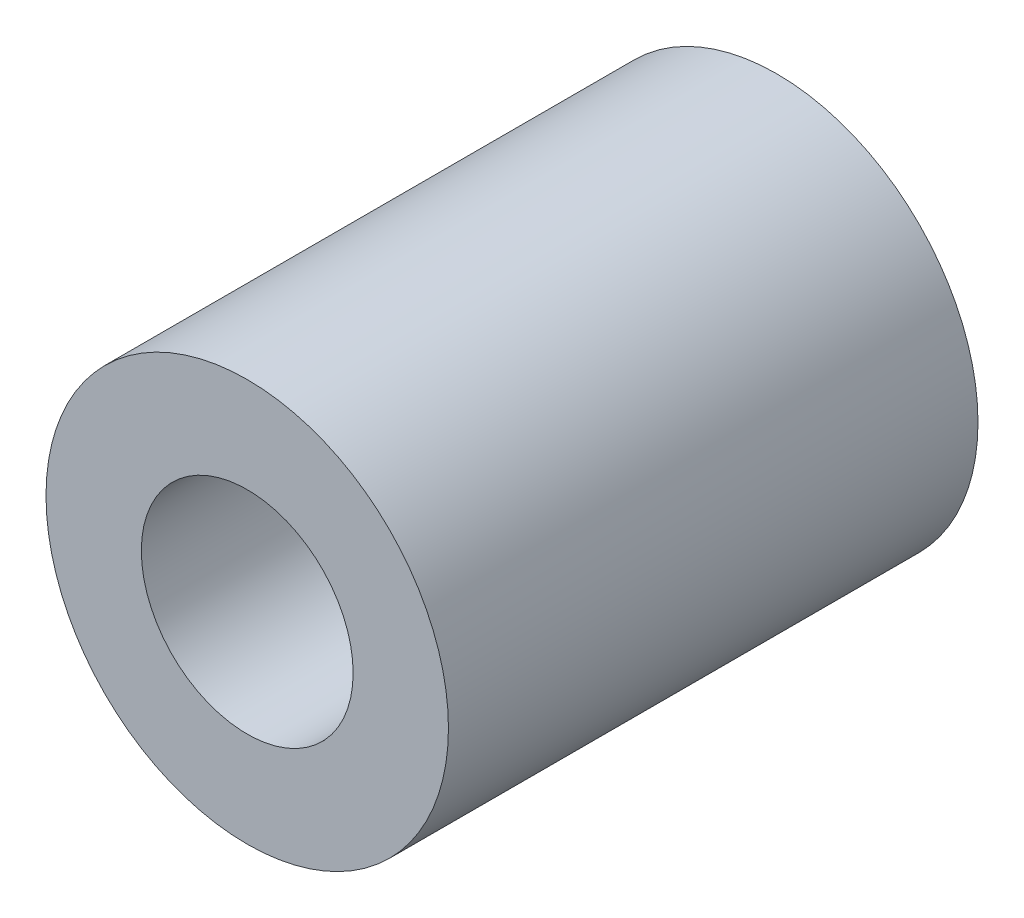
ISO-10303-21;
HEADER;
FILE_DESCRIPTION(('STEP AP214'),'2;1');
FILE_NAME('part.step','',(''),(''),'','','');
FILE_SCHEMA(('AUTOMOTIVE_DESIGN { 1 0 10303 214 1 1 1 1 }'));
ENDSEC;
DATA;
#1=APPLICATION_CONTEXT('core data for automotive mechanical design processes');
#2=APPLICATION_PROTOCOL_DEFINITION('international standard','automotive_design',2000,#1);
#3=PRODUCT_CONTEXT('',#1,'mechanical');
#4=PRODUCT('Part','Part','',(#3));
#5=PRODUCT_RELATED_PRODUCT_CATEGORY('part','',(#4));
#6=PRODUCT_DEFINITION_FORMATION('','',#4);
#7=PRODUCT_DEFINITION_CONTEXT('part definition',#1,'design');
#8=PRODUCT_DEFINITION('design','',#6,#7);
#9=PRODUCT_DEFINITION_SHAPE('','',#8);
#10=(LENGTH_UNIT() NAMED_UNIT(*) SI_UNIT(.MILLI.,.METRE.));
#11=(NAMED_UNIT(*) PLANE_ANGLE_UNIT() SI_UNIT($,.RADIAN.));
#12=(NAMED_UNIT(*) SI_UNIT($,.STERADIAN.) SOLID_ANGLE_UNIT());
#13=UNCERTAINTY_MEASURE_WITH_UNIT(LENGTH_MEASURE(1.E-05),#10,'distance_accuracy_value','');
#14=(GEOMETRIC_REPRESENTATION_CONTEXT(3) GLOBAL_UNCERTAINTY_ASSIGNED_CONTEXT((#13)) GLOBAL_UNIT_ASSIGNED_CONTEXT((#10,
#11,#12)) REPRESENTATION_CONTEXT('',''));
#15=CARTESIAN_POINT('',(0.,0.,0.));
#16=DIRECTION('',(0.,0.,1.));
#17=DIRECTION('',(1.,0.,0.));
#18=AXIS2_PLACEMENT_3D('',#15,#16,#17);
#19=CARTESIAN_POINT('',(0.,0.,25.));
#20=DIRECTION('',(0.,0.,1.));
#21=DIRECTION('',(1.,0.,0.));
#22=AXIS2_PLACEMENT_3D('',#19,#20,#21);
#23=PLANE('',#22);
#24=CARTESIAN_POINT('',(0.,0.,25.));
#25=DIRECTION('',(0.,0.,1.));
#26=DIRECTION('',(1.,0.,0.));
#27=AXIS2_PLACEMENT_3D('',#24,#25,#26);
#28=CIRCLE('',#27,9.5);
#29=CARTESIAN_POINT('',(9.5,0.,25.));
#30=VERTEX_POINT('',#29);
#31=EDGE_CURVE('E10',#30,#30,#28,.T.);
#32=ORIENTED_EDGE('',*,*,#31,.T.);
#33=EDGE_LOOP('',(#32));
#34=FACE_BOUND('',#33,.T.);
#35=CARTESIAN_POINT('',(0.,0.,25.));
#36=DIRECTION('',(0.,0.,1.));
#37=DIRECTION('',(1.,0.,0.));
#38=AXIS2_PLACEMENT_3D('',#35,#36,#37);
#39=CIRCLE('',#38,5.);
#40=CARTESIAN_POINT('',(5.,0.,25.));
#41=VERTEX_POINT('',#40);
#42=EDGE_CURVE('E43',#41,#41,#39,.T.);
#43=ORIENTED_EDGE('',*,*,#42,.F.);
#44=EDGE_LOOP('',(#43));
#45=FACE_BOUND('',#44,.T.);
#46=ADVANCED_FACE('F32',(#34,#45),#23,.T.);
#47=CARTESIAN_POINT('',(0.,0.,0.));
#48=DIRECTION('',(0.,0.,1.));
#49=DIRECTION('',(1.,0.,0.));
#50=AXIS2_PLACEMENT_3D('',#47,#48,#49);
#51=PLANE('',#50);
#52=CARTESIAN_POINT('',(0.,0.,0.));
#53=DIRECTION('',(0.,0.,1.));
#54=DIRECTION('',(1.,0.,0.));
#55=AXIS2_PLACEMENT_3D('',#52,#53,#54);
#56=CIRCLE('',#55,9.5);
#57=CARTESIAN_POINT('',(9.5,0.,0.));
#58=VERTEX_POINT('',#57);
#59=EDGE_CURVE('E36',#58,#58,#56,.T.);
#60=ORIENTED_EDGE('',*,*,#59,.F.);
#61=EDGE_LOOP('',(#60));
#62=FACE_BOUND('',#61,.T.);
#63=CARTESIAN_POINT('',(0.,0.,0.));
#64=DIRECTION('',(0.,0.,1.));
#65=DIRECTION('',(1.,0.,0.));
#66=AXIS2_PLACEMENT_3D('',#63,#64,#65);
#67=CIRCLE('',#66,5.);
#68=CARTESIAN_POINT('',(5.,0.,0.));
#69=VERTEX_POINT('',#68);
#70=EDGE_CURVE('E45',#69,#69,#67,.T.);
#71=ORIENTED_EDGE('',*,*,#70,.T.);
#72=EDGE_LOOP('',(#71));
#73=FACE_BOUND('',#72,.T.);
#74=ADVANCED_FACE('F55',(#62,#73),#51,.F.);
#75=CARTESIAN_POINT('',(0.,0.,25.));
#76=DIRECTION('',(0.,0.,-1.));
#77=DIRECTION('',(-1.,0.,0.));
#78=AXIS2_PLACEMENT_3D('',#75,#76,#77);
#79=CYLINDRICAL_SURFACE('',#78,9.5);
#80=ORIENTED_EDGE('',*,*,#31,.F.);
#81=EDGE_LOOP('',(#80));
#82=FACE_BOUND('',#81,.T.);
#83=ORIENTED_EDGE('',*,*,#59,.T.);
#84=EDGE_LOOP('',(#83));
#85=FACE_BOUND('',#84,.T.);
#86=ADVANCED_FACE('F34',(#82,#85),#79,.T.);
#87=CARTESIAN_POINT('',(0.,0.,25.));
#88=DIRECTION('',(0.,0.,-1.));
#89=DIRECTION('',(-1.,0.,0.));
#90=AXIS2_PLACEMENT_3D('',#87,#88,#89);
#91=CYLINDRICAL_SURFACE('',#90,5.);
#92=ORIENTED_EDGE('',*,*,#42,.T.);
#93=EDGE_LOOP('',(#92));
#94=FACE_BOUND('',#93,.T.);
#95=ORIENTED_EDGE('',*,*,#70,.F.);
#96=EDGE_LOOP('',(#95));
#97=FACE_BOUND('',#96,.T.);
#98=ADVANCED_FACE('F51',(#94,#97),#91,.F.);
#99=CLOSED_SHELL('',(#46,#74,#86,#98));
#100=MANIFOLD_SOLID_BREP('B2',#99);
#101=ADVANCED_BREP_SHAPE_REPRESENTATION('',(#18,#100),#14);
#102=SHAPE_DEFINITION_REPRESENTATION(#9,#101);
ENDSEC;
END-ISO-10303-21;
